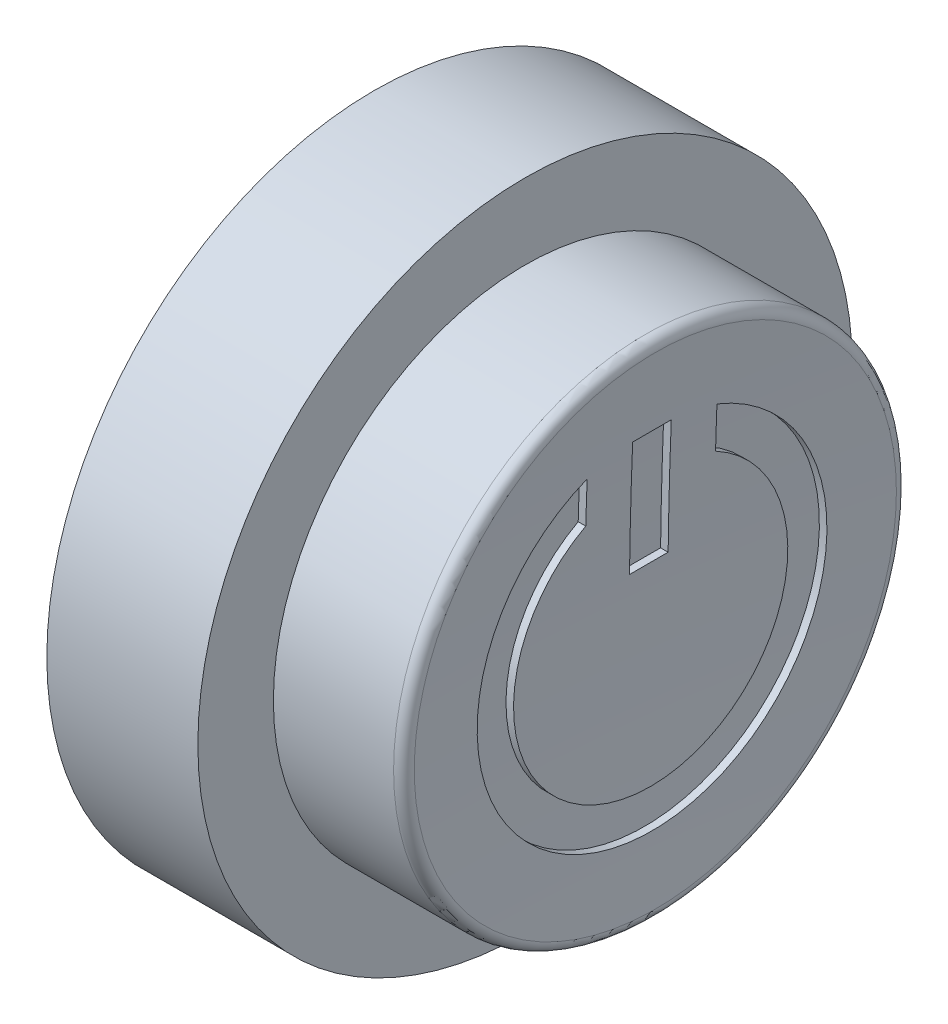
ISO-10303-21;
HEADER;
FILE_DESCRIPTION(('STEP AP214'),'2;1');
FILE_NAME('part.step','',(''),(''),'','','');
FILE_SCHEMA(('AUTOMOTIVE_DESIGN { 1 0 10303 214 1 1 1 1 }'));
ENDSEC;
DATA;
#1=APPLICATION_CONTEXT('core data for automotive mechanical design processes');
#2=APPLICATION_PROTOCOL_DEFINITION('international standard','automotive_design',2000,#1);
#3=PRODUCT_CONTEXT('',#1,'mechanical');
#4=PRODUCT('Part','Part','',(#3));
#5=PRODUCT_RELATED_PRODUCT_CATEGORY('part','',(#4));
#6=PRODUCT_DEFINITION_FORMATION('','',#4);
#7=PRODUCT_DEFINITION_CONTEXT('part definition',#1,'design');
#8=PRODUCT_DEFINITION('design','',#6,#7);
#9=PRODUCT_DEFINITION_SHAPE('','',#8);
#10=(LENGTH_UNIT() NAMED_UNIT(*) SI_UNIT(.MILLI.,.METRE.));
#11=(NAMED_UNIT(*) PLANE_ANGLE_UNIT() SI_UNIT($,.RADIAN.));
#12=(NAMED_UNIT(*) SI_UNIT($,.STERADIAN.) SOLID_ANGLE_UNIT());
#13=UNCERTAINTY_MEASURE_WITH_UNIT(LENGTH_MEASURE(1.E-05),#10,'distance_accuracy_value','');
#14=(GEOMETRIC_REPRESENTATION_CONTEXT(3) GLOBAL_UNCERTAINTY_ASSIGNED_CONTEXT((#13)) GLOBAL_UNIT_ASSIGNED_CONTEXT((#10,
#11,#12)) REPRESENTATION_CONTEXT('',''));
#15=CARTESIAN_POINT('',(0.,0.,0.));
#16=DIRECTION('',(0.,0.,1.));
#17=DIRECTION('',(1.,0.,0.));
#18=AXIS2_PLACEMENT_3D('',#15,#16,#17);
#19=CARTESIAN_POINT('',(154.758333333335,0.,0.));
#20=DIRECTION('',(0.,0.,1.));
#21=DIRECTION('',(1.,0.,0.));
#22=AXIS2_PLACEMENT_3D('',#19,#20,#21);
#23=SPHERICAL_SURFACE('',#22,83.4083333333348);
#24=CARTESIAN_POINT('',(71.4875691609517,0.,0.));
#25=DIRECTION('',(1.,0.,0.));
#26=DIRECTION('',(0.,0.,-1.));
#27=AXIS2_PLACEMENT_3D('',#24,#25,#26);
#28=CIRCLE('',#27,4.78851789095983);
#29=CARTESIAN_POINT('',(71.4875691609517,0.,-4.78851789095983));
#30=VERTEX_POINT('',#29);
#31=EDGE_CURVE('E11',#30,#30,#28,.T.);
#32=ORIENTED_EDGE('',*,*,#31,.T.);
#33=EDGE_LOOP('',(#32));
#34=FACE_BOUND('',#33,.T.);
#35=CARTESIAN_POINT('',(154.758333333335,0.,-0.383692180332946));
#36=DIRECTION('',(0.,0.,1.));
#37=DIRECTION('',(1.,0.,0.));
#38=AXIS2_PLACEMENT_3D('',#35,#36,#37);
#39=CIRCLE('',#38,83.4074508048019);
#40=CARTESIAN_POINT('',(71.4203978778737,3.40460919590601,-0.383692180332937));
#41=VERTEX_POINT('',#40);
#42=CARTESIAN_POINT('',(71.3580757273673,1.09539080409399,-0.383692180332956));
#43=VERTEX_POINT('',#42);
#44=EDGE_CURVE('E148',#41,#43,#39,.T.);
#45=ORIENTED_EDGE('',*,*,#44,.T.);
#46=CARTESIAN_POINT('',(154.758333333335,1.09539080409399,0.));
#47=DIRECTION('',(0.,1.,0.));
#48=DIRECTION('',(0.,0.,1.));
#49=AXIS2_PLACEMENT_3D('',#46,#47,#48);
#50=CIRCLE('',#49,83.401140210617);
#51=CARTESIAN_POINT('',(71.3580757273672,1.09539080409399,0.38369218033294));
#52=VERTEX_POINT('',#51);
#53=EDGE_CURVE('E153',#43,#52,#50,.T.);
#54=ORIENTED_EDGE('',*,*,#53,.T.);
#55=CARTESIAN_POINT('',(154.758333333335,0.,0.383692180332946));
#56=DIRECTION('',(0.,0.,-1.));
#57=DIRECTION('',(-1.,0.,0.));
#58=AXIS2_PLACEMENT_3D('',#55,#56,#57);
#59=CIRCLE('',#58,83.4074508048019);
#60=CARTESIAN_POINT('',(71.4203978778737,3.40460919590601,0.383692180332946));
#61=VERTEX_POINT('',#60);
#62=EDGE_CURVE('E140',#52,#61,#59,.T.);
#63=ORIENTED_EDGE('',*,*,#62,.T.);
#64=CARTESIAN_POINT('',(154.758333333335,3.40460919590601,0.));
#65=DIRECTION('',(0.,-1.,0.));
#66=DIRECTION('',(0.,0.,-1.));
#67=AXIS2_PLACEMENT_3D('',#64,#65,#66);
#68=CIRCLE('',#67,83.3388187201369);
#69=EDGE_CURVE('E145',#61,#41,#68,.T.);
#70=ORIENTED_EDGE('',*,*,#69,.T.);
#71=EDGE_LOOP('',(#45,#54,#63,#70));
#72=FACE_BOUND('',#71,.T.);
#73=CARTESIAN_POINT('',(71.4223832634752,0.,0.));
#74=DIRECTION('',(1.,0.,0.));
#75=DIRECTION('',(0.,0.,-1.));
#76=AXIS2_PLACEMENT_3D('',#73,#74,#75);
#77=CIRCLE('',#76,3.47411793100769);
#78=CARTESIAN_POINT('',(71.4223832634752,3.22610403637305,1.28908810600622));
#79=VERTEX_POINT('',#78);
#80=CARTESIAN_POINT('',(71.4223832634752,3.22610403637305,-1.28908810600623));
#81=VERTEX_POINT('',#80);
#82=EDGE_CURVE('E51',#79,#81,#77,.T.);
#83=ORIENTED_EDGE('',*,*,#82,.F.);
#84=CARTESIAN_POINT('',(154.758333333335,0.,1.28908810600623));
#85=DIRECTION('',(0.,0.,1.));
#86=DIRECTION('',(1.,0.,0.));
#87=AXIS2_PLACEMENT_3D('',#84,#85,#86);
#88=CIRCLE('',#87,83.3983712149083);
#89=CARTESIAN_POINT('',(71.3944967437041,2.39980631655784,1.28908810600623));
#90=VERTEX_POINT('',#89);
#91=EDGE_CURVE('E110',#79,#90,#88,.T.);
#92=ORIENTED_EDGE('',*,*,#91,.T.);
#93=CARTESIAN_POINT('',(71.3944967437041,0.,0.));
#94=DIRECTION('',(1.,0.,0.));
#95=DIRECTION('',(0.,0.,-1.));
#96=AXIS2_PLACEMENT_3D('',#93,#94,#95);
#97=CIRCLE('',#96,2.72411793100769);
#98=CARTESIAN_POINT('',(71.3944967437041,2.39980631655784,-1.28908810600623));
#99=VERTEX_POINT('',#98);
#100=EDGE_CURVE('E129',#90,#99,#97,.T.);
#101=ORIENTED_EDGE('',*,*,#100,.T.);
#102=CARTESIAN_POINT('',(154.758333333335,0.,-1.28908810600623));
#103=DIRECTION('',(0.,0.,-1.));
#104=DIRECTION('',(-1.,0.,0.));
#105=AXIS2_PLACEMENT_3D('',#102,#103,#104);
#106=CIRCLE('',#105,83.3983712149083);
#107=EDGE_CURVE('E120',#99,#81,#106,.T.);
#108=ORIENTED_EDGE('',*,*,#107,.T.);
#109=EDGE_LOOP('',(#83,#92,#101,#108));
#110=FACE_BOUND('',#109,.T.);
#111=ADVANCED_FACE('F36',(#34,#72,#110),#23,.F.);
#112=CARTESIAN_POINT('',(70.5,0.,0.));
#113=DIRECTION('',(-1.,0.,0.));
#114=DIRECTION('',(0.,0.,1.));
#115=AXIS2_PLACEMENT_3D('',#112,#113,#114);
#116=CYLINDRICAL_SURFACE('',#115,5.);
#117=CARTESIAN_POINT('',(71.2878990300558,0.,0.));
#118=DIRECTION('',(1.,0.,0.));
#119=DIRECTION('',(0.,0.,-1.));
#120=AXIS2_PLACEMENT_3D('',#117,#118,#119);
#121=CIRCLE('',#120,5.);
#122=CARTESIAN_POINT('',(71.2878990300558,0.,-5.));
#123=VERTEX_POINT('',#122);
#124=EDGE_CURVE('E44',#123,#123,#121,.F.);
#125=ORIENTED_EDGE('',*,*,#124,.T.);
#126=EDGE_LOOP('',(#125));
#127=FACE_BOUND('',#126,.T.);
#128=CARTESIAN_POINT('',(68.9,0.,0.));
#129=DIRECTION('',(-1.,0.,0.));
#130=DIRECTION('',(0.,0.,1.));
#131=AXIS2_PLACEMENT_3D('',#128,#129,#130);
#132=CIRCLE('',#131,5.);
#133=CARTESIAN_POINT('',(68.9,0.,5.));
#134=VERTEX_POINT('',#133);
#135=EDGE_CURVE('E143',#134,#134,#132,.T.);
#136=ORIENTED_EDGE('',*,*,#135,.F.);
#137=EDGE_LOOP('',(#136));
#138=FACE_BOUND('',#137,.T.);
#139=ADVANCED_FACE('F192',(#127,#138),#116,.T.);
#140=CARTESIAN_POINT('',(70.5,1.75,0.));
#141=DIRECTION('',(1.,0.,0.));
#142=DIRECTION('',(0.,0.,-1.));
#143=AXIS2_PLACEMENT_3D('',#140,#141,#142);
#144=PLANE('',#143);
#145=CARTESIAN_POINT('',(70.5,0.,0.));
#146=DIRECTION('',(-1.,0.,0.));
#147=DIRECTION('',(0.,0.,1.));
#148=AXIS2_PLACEMENT_3D('',#145,#146,#147);
#149=CIRCLE('',#148,1.75);
#150=CARTESIAN_POINT('',(70.5,0.,1.75));
#151=VERTEX_POINT('',#150);
#152=EDGE_CURVE('E187',#151,#151,#149,.T.);
#153=ORIENTED_EDGE('',*,*,#152,.T.);
#154=EDGE_LOOP('',(#153));
#155=FACE_BOUND('',#154,.T.);
#156=ADVANCED_FACE('F221',(#155),#144,.F.);
#157=CARTESIAN_POINT('',(70.5,0.,0.));
#158=DIRECTION('',(-1.,0.,0.));
#159=DIRECTION('',(0.,0.,1.));
#160=AXIS2_PLACEMENT_3D('',#157,#158,#159);
#161=CYLINDRICAL_SURFACE('',#160,1.75);
#162=ORIENTED_EDGE('',*,*,#152,.F.);
#163=EDGE_LOOP('',(#162));
#164=FACE_BOUND('',#163,.T.);
#165=CARTESIAN_POINT('',(67.5,0.,0.));
#166=DIRECTION('',(-1.,0.,0.));
#167=DIRECTION('',(0.,0.,1.));
#168=AXIS2_PLACEMENT_3D('',#165,#166,#167);
#169=CIRCLE('',#168,1.75);
#170=CARTESIAN_POINT('',(67.5,0.,1.75));
#171=VERTEX_POINT('',#170);
#172=EDGE_CURVE('E184',#171,#171,#169,.T.);
#173=ORIENTED_EDGE('',*,*,#172,.T.);
#174=EDGE_LOOP('',(#173));
#175=FACE_BOUND('',#174,.T.);
#176=ADVANCED_FACE('F227',(#164,#175),#161,.F.);
#177=CARTESIAN_POINT('',(67.5,5.25,0.));
#178=DIRECTION('',(1.,0.,0.));
#179=DIRECTION('',(0.,0.,-1.));
#180=AXIS2_PLACEMENT_3D('',#177,#178,#179);
#181=PLANE('',#180);
#182=ORIENTED_EDGE('',*,*,#172,.F.);
#183=EDGE_LOOP('',(#182));
#184=FACE_BOUND('',#183,.T.);
#185=CARTESIAN_POINT('',(67.5,0.,0.));
#186=DIRECTION('',(-1.,0.,0.));
#187=DIRECTION('',(0.,0.,1.));
#188=AXIS2_PLACEMENT_3D('',#185,#186,#187);
#189=CIRCLE('',#188,5.25);
#190=CARTESIAN_POINT('',(67.5,0.,5.25));
#191=VERTEX_POINT('',#190);
#192=EDGE_CURVE('E181',#191,#191,#189,.T.);
#193=ORIENTED_EDGE('',*,*,#192,.T.);
#194=EDGE_LOOP('',(#193));
#195=FACE_BOUND('',#194,.T.);
#196=ADVANCED_FACE('F231',(#184,#195),#181,.F.);
#197=CARTESIAN_POINT('',(70.5,0.,0.));
#198=DIRECTION('',(-1.,0.,0.));
#199=DIRECTION('',(0.,0.,1.));
#200=AXIS2_PLACEMENT_3D('',#197,#198,#199);
#201=CYLINDRICAL_SURFACE('',#200,5.25);
#202=ORIENTED_EDGE('',*,*,#192,.F.);
#203=EDGE_LOOP('',(#202));
#204=FACE_BOUND('',#203,.T.);
#205=CARTESIAN_POINT('',(65.9,0.,0.));
#206=DIRECTION('',(-1.,0.,0.));
#207=DIRECTION('',(0.,0.,1.));
#208=AXIS2_PLACEMENT_3D('',#205,#206,#207);
#209=CIRCLE('',#208,5.25);
#210=CARTESIAN_POINT('',(65.9,0.,5.25));
#211=VERTEX_POINT('',#210);
#212=EDGE_CURVE('E178',#211,#211,#209,.T.);
#213=ORIENTED_EDGE('',*,*,#212,.T.);
#214=EDGE_LOOP('',(#213));
#215=FACE_BOUND('',#214,.T.);
#216=ADVANCED_FACE('F235',(#204,#215),#201,.F.);
#217=CARTESIAN_POINT('',(65.9,5.25,0.));
#218=DIRECTION('',(1.,0.,0.));
#219=DIRECTION('',(0.,0.,-1.));
#220=AXIS2_PLACEMENT_3D('',#217,#218,#219);
#221=PLANE('',#220);
#222=ORIENTED_EDGE('',*,*,#212,.F.);
#223=EDGE_LOOP('',(#222));
#224=FACE_BOUND('',#223,.T.);
#225=CARTESIAN_POINT('',(65.9,0.,0.));
#226=DIRECTION('',(-1.,0.,0.));
#227=DIRECTION('',(0.,0.,1.));
#228=AXIS2_PLACEMENT_3D('',#225,#226,#227);
#229=CIRCLE('',#228,6.5);
#230=CARTESIAN_POINT('',(65.9,0.,6.5));
#231=VERTEX_POINT('',#230);
#232=EDGE_CURVE('E175',#231,#231,#229,.T.);
#233=ORIENTED_EDGE('',*,*,#232,.T.);
#234=EDGE_LOOP('',(#233));
#235=FACE_BOUND('',#234,.T.);
#236=ADVANCED_FACE('F239',(#224,#235),#221,.F.);
#237=CARTESIAN_POINT('',(70.5,0.,0.));
#238=DIRECTION('',(-1.,0.,0.));
#239=DIRECTION('',(0.,0.,1.));
#240=AXIS2_PLACEMENT_3D('',#237,#238,#239);
#241=CYLINDRICAL_SURFACE('',#240,6.5);
#242=ORIENTED_EDGE('',*,*,#232,.F.);
#243=EDGE_LOOP('',(#242));
#244=FACE_BOUND('',#243,.T.);
#245=CARTESIAN_POINT('',(68.9,0.,0.));
#246=DIRECTION('',(-1.,0.,0.));
#247=DIRECTION('',(0.,0.,1.));
#248=AXIS2_PLACEMENT_3D('',#245,#246,#247);
#249=CIRCLE('',#248,6.5);
#250=CARTESIAN_POINT('',(68.9,0.,6.5));
#251=VERTEX_POINT('',#250);
#252=EDGE_CURVE('E172',#251,#251,#249,.T.);
#253=ORIENTED_EDGE('',*,*,#252,.T.);
#254=EDGE_LOOP('',(#253));
#255=FACE_BOUND('',#254,.T.);
#256=ADVANCED_FACE('F208',(#244,#255),#241,.T.);
#257=CARTESIAN_POINT('',(68.9,6.5,0.));
#258=DIRECTION('',(-1.,0.,0.));
#259=DIRECTION('',(0.,0.,1.));
#260=AXIS2_PLACEMENT_3D('',#257,#258,#259);
#261=PLANE('',#260);
#262=ORIENTED_EDGE('',*,*,#252,.F.);
#263=EDGE_LOOP('',(#262));
#264=FACE_BOUND('',#263,.T.);
#265=ORIENTED_EDGE('',*,*,#135,.T.);
#266=EDGE_LOOP('',(#265));
#267=FACE_BOUND('',#266,.T.);
#268=ADVANCED_FACE('F197',(#264,#267),#261,.F.);
#269=CARTESIAN_POINT('',(71.2878990300558,0.,0.));
#270=DIRECTION('',(1.,0.,0.));
#271=DIRECTION('',(0.,0.,-1.));
#272=AXIS2_PLACEMENT_3D('',#269,#270,#271);
#273=TOROIDAL_SURFACE('',#272,4.8,0.2);
#274=ORIENTED_EDGE('',*,*,#31,.F.);
#275=EDGE_LOOP('',(#274));
#276=FACE_BOUND('',#275,.T.);
#277=ORIENTED_EDGE('',*,*,#124,.F.);
#278=EDGE_LOOP('',(#277));
#279=FACE_BOUND('',#278,.T.);
#280=ADVANCED_FACE('F38',(#276,#279),#273,.T.);
#281=CARTESIAN_POINT('',(154.608333333335,0.,0.));
#282=DIRECTION('',(0.,0.,1.));
#283=DIRECTION('',(1.,0.,0.));
#284=AXIS2_PLACEMENT_3D('',#281,#282,#283);
#285=SPHERICAL_SURFACE('',#284,83.4083333333348);
#286=CARTESIAN_POINT('',(154.608333333335,0.,0.383692180332946));
#287=DIRECTION('',(0.,0.,-1.));
#288=DIRECTION('',(-1.,0.,0.));
#289=AXIS2_PLACEMENT_3D('',#286,#287,#288);
#290=CIRCLE('',#289,83.4074508048019);
#291=CARTESIAN_POINT('',(71.2080757273673,1.09539080409399,0.38369218033294));
#292=VERTEX_POINT('',#291);
#293=CARTESIAN_POINT('',(71.2703978778737,3.40460919590601,0.383692180332952));
#294=VERTEX_POINT('',#293);
#295=EDGE_CURVE('E144',#292,#294,#290,.T.);
#296=ORIENTED_EDGE('',*,*,#295,.F.);
#297=CARTESIAN_POINT('',(154.608333333335,1.09539080409399,0.));
#298=DIRECTION('',(0.,1.,0.));
#299=DIRECTION('',(0.,0.,1.));
#300=AXIS2_PLACEMENT_3D('',#297,#298,#299);
#301=CIRCLE('',#300,83.401140210617);
#302=CARTESIAN_POINT('',(71.2080757273673,1.09539080409399,-0.383692180332956));
#303=VERTEX_POINT('',#302);
#304=EDGE_CURVE('E116',#303,#292,#301,.T.);
#305=ORIENTED_EDGE('',*,*,#304,.F.);
#306=CARTESIAN_POINT('',(154.608333333335,0.,-0.383692180332946));
#307=DIRECTION('',(0.,0.,1.));
#308=DIRECTION('',(1.,0.,0.));
#309=AXIS2_PLACEMENT_3D('',#306,#307,#308);
#310=CIRCLE('',#309,83.4074508048019);
#311=CARTESIAN_POINT('',(71.2703978778738,3.40460919590601,-0.383692180332937));
#312=VERTEX_POINT('',#311);
#313=EDGE_CURVE('E160',#312,#303,#310,.T.);
#314=ORIENTED_EDGE('',*,*,#313,.F.);
#315=CARTESIAN_POINT('',(154.608333333335,3.40460919590601,0.));
#316=DIRECTION('',(0.,-1.,0.));
#317=DIRECTION('',(0.,0.,-1.));
#318=AXIS2_PLACEMENT_3D('',#315,#316,#317);
#319=CIRCLE('',#318,83.3388187201369);
#320=EDGE_CURVE('E151',#294,#312,#319,.T.);
#321=ORIENTED_EDGE('',*,*,#320,.F.);
#322=EDGE_LOOP('',(#296,#305,#314,#321));
#323=FACE_BOUND('',#322,.T.);
#324=ADVANCED_FACE('F196',(#323),#285,.F.);
#325=CARTESIAN_POINT('',(71.3580757273672,1.09539080409399,0.383692180332946));
#326=DIRECTION('',(0.,-1.,0.));
#327=DIRECTION('',(0.,0.,-1.));
#328=AXIS2_PLACEMENT_3D('',#325,#326,#327);
#329=PLANE('',#328);
#330=ORIENTED_EDGE('',*,*,#304,.T.);
#331=DIRECTION('',(-1.,0.,0.));
#332=VECTOR('',#331,1.);
#333=CARTESIAN_POINT('',(71.3580757273672,1.09539080409399,0.383692180332946));
#334=LINE('',#333,#332);
#335=EDGE_CURVE('E156',#52,#292,#334,.T.);
#336=ORIENTED_EDGE('',*,*,#335,.F.);
#337=ORIENTED_EDGE('',*,*,#53,.F.);
#338=DIRECTION('',(-1.,0.,0.));
#339=VECTOR('',#338,1.);
#340=CARTESIAN_POINT('',(71.3580757273673,1.09539080409399,-0.383692180332946));
#341=LINE('',#340,#339);
#342=EDGE_CURVE('E157',#43,#303,#341,.T.);
#343=ORIENTED_EDGE('',*,*,#342,.T.);
#344=EDGE_LOOP('',(#330,#336,#337,#343));
#345=FACE_BOUND('',#344,.T.);
#346=ADVANCED_FACE('F204',(#345),#329,.F.);
#347=CARTESIAN_POINT('',(71.3580757273673,1.09539080409399,-0.383692180332946));
#348=DIRECTION('',(0.,0.,-1.));
#349=DIRECTION('',(0.,1.,0.));
#350=AXIS2_PLACEMENT_3D('',#347,#348,#349);
#351=PLANE('',#350);
#352=ORIENTED_EDGE('',*,*,#313,.T.);
#353=ORIENTED_EDGE('',*,*,#342,.F.);
#354=ORIENTED_EDGE('',*,*,#44,.F.);
#355=DIRECTION('',(-1.,0.,0.));
#356=VECTOR('',#355,1.);
#357=CARTESIAN_POINT('',(71.4203978778738,3.40460919590601,-0.383692180332928));
#358=LINE('',#357,#356);
#359=EDGE_CURVE('E152',#41,#312,#358,.T.);
#360=ORIENTED_EDGE('',*,*,#359,.T.);
#361=EDGE_LOOP('',(#352,#353,#354,#360));
#362=FACE_BOUND('',#361,.T.);
#363=ADVANCED_FACE('F249',(#362),#351,.F.);
#364=CARTESIAN_POINT('',(71.4203978778738,3.40460919590601,-0.383692180332928));
#365=DIRECTION('',(0.,1.,0.));
#366=DIRECTION('',(0.,0.,1.));
#367=AXIS2_PLACEMENT_3D('',#364,#365,#366);
#368=PLANE('',#367);
#369=ORIENTED_EDGE('',*,*,#320,.T.);
#370=ORIENTED_EDGE('',*,*,#359,.F.);
#371=ORIENTED_EDGE('',*,*,#69,.F.);
#372=DIRECTION('',(-1.,0.,0.));
#373=VECTOR('',#372,1.);
#374=CARTESIAN_POINT('',(71.4203978778737,3.40460919590601,0.383692180332946));
#375=LINE('',#374,#373);
#376=EDGE_CURVE('E59',#61,#294,#375,.T.);
#377=ORIENTED_EDGE('',*,*,#376,.T.);
#378=EDGE_LOOP('',(#369,#370,#371,#377));
#379=FACE_BOUND('',#378,.T.);
#380=ADVANCED_FACE('F214',(#379),#368,.F.);
#381=CARTESIAN_POINT('',(71.4203978778737,3.40460919590601,0.383692180332946));
#382=DIRECTION('',(0.,0.,1.));
#383=DIRECTION('',(1.,0.,0.));
#384=AXIS2_PLACEMENT_3D('',#381,#382,#383);
#385=PLANE('',#384);
#386=ORIENTED_EDGE('',*,*,#295,.T.);
#387=ORIENTED_EDGE('',*,*,#376,.F.);
#388=ORIENTED_EDGE('',*,*,#62,.F.);
#389=ORIENTED_EDGE('',*,*,#335,.T.);
#390=EDGE_LOOP('',(#386,#387,#388,#389));
#391=FACE_BOUND('',#390,.T.);
#392=ADVANCED_FACE('F199',(#391),#385,.F.);
#393=CARTESIAN_POINT('',(154.608333333335,0.,0.));
#394=DIRECTION('',(0.,0.,1.));
#395=DIRECTION('',(1.,0.,0.));
#396=AXIS2_PLACEMENT_3D('',#393,#394,#395);
#397=SPHERICAL_SURFACE('',#396,83.4083333333348);
#398=CARTESIAN_POINT('',(154.608333333335,0.,1.28908810600623));
#399=DIRECTION('',(0.,0.,1.));
#400=DIRECTION('',(1.,0.,0.));
#401=AXIS2_PLACEMENT_3D('',#398,#399,#400);
#402=CIRCLE('',#401,83.3983712149083);
#403=CARTESIAN_POINT('',(71.2723832634751,3.22610403637305,1.28908810600622));
#404=VERTEX_POINT('',#403);
#405=CARTESIAN_POINT('',(71.2444967437041,2.39980631655784,1.28908810600623));
#406=VERTEX_POINT('',#405);
#407=EDGE_CURVE('E117',#404,#406,#402,.T.);
#408=ORIENTED_EDGE('',*,*,#407,.F.);
#409=CARTESIAN_POINT('',(71.2723832634751,0.,0.));
#410=DIRECTION('',(1.,0.,0.));
#411=DIRECTION('',(0.,0.,-1.));
#412=AXIS2_PLACEMENT_3D('',#409,#410,#411);
#413=CIRCLE('',#412,3.47411793100769);
#414=CARTESIAN_POINT('',(71.2723832634751,3.22610403637304,-1.28908810600623));
#415=VERTEX_POINT('',#414);
#416=EDGE_CURVE('E104',#404,#415,#413,.T.);
#417=ORIENTED_EDGE('',*,*,#416,.T.);
#418=CARTESIAN_POINT('',(154.608333333335,0.,-1.28908810600623));
#419=DIRECTION('',(0.,0.,-1.));
#420=DIRECTION('',(-1.,0.,0.));
#421=AXIS2_PLACEMENT_3D('',#418,#419,#420);
#422=CIRCLE('',#421,83.3983712149083);
#423=CARTESIAN_POINT('',(71.2444967437041,2.39980631655784,-1.28908810600623));
#424=VERTEX_POINT('',#423);
#425=EDGE_CURVE('E123',#424,#415,#422,.T.);
#426=ORIENTED_EDGE('',*,*,#425,.F.);
#427=CARTESIAN_POINT('',(71.2444967437041,0.,0.));
#428=DIRECTION('',(1.,0.,0.));
#429=DIRECTION('',(0.,0.,-1.));
#430=AXIS2_PLACEMENT_3D('',#427,#428,#429);
#431=CIRCLE('',#430,2.72411793100769);
#432=EDGE_CURVE('E130',#406,#424,#431,.T.);
#433=ORIENTED_EDGE('',*,*,#432,.F.);
#434=EDGE_LOOP('',(#408,#417,#426,#433));
#435=FACE_BOUND('',#434,.T.);
#436=ADVANCED_FACE('F213',(#435),#397,.F.);
#437=CARTESIAN_POINT('',(71.4223832634752,0.,0.));
#438=DIRECTION('',(-1.,0.,0.));
#439=DIRECTION('',(0.,0.,1.));
#440=AXIS2_PLACEMENT_3D('',#437,#438,#439);
#441=CYLINDRICAL_SURFACE('',#440,3.47411793100769);
#442=ORIENTED_EDGE('',*,*,#416,.F.);
#443=DIRECTION('',(-1.,0.,0.));
#444=VECTOR('',#443,1.);
#445=CARTESIAN_POINT('',(71.4223832634752,3.22610403637305,1.28908810600623));
#446=LINE('',#445,#444);
#447=EDGE_CURVE('E101',#79,#404,#446,.T.);
#448=ORIENTED_EDGE('',*,*,#447,.F.);
#449=ORIENTED_EDGE('',*,*,#82,.T.);
#450=DIRECTION('',(-1.,0.,0.));
#451=VECTOR('',#450,1.);
#452=CARTESIAN_POINT('',(71.4223832634752,3.22610403637304,-1.28908810600623));
#453=LINE('',#452,#451);
#454=EDGE_CURVE('E121',#81,#415,#453,.T.);
#455=ORIENTED_EDGE('',*,*,#454,.T.);
#456=EDGE_LOOP('',(#442,#448,#449,#455));
#457=FACE_BOUND('',#456,.T.);
#458=ADVANCED_FACE('F103',(#457),#441,.F.);
#459=CARTESIAN_POINT('',(71.3944967437041,2.39980631655784,1.28908810600623));
#460=DIRECTION('',(0.,0.,-1.));
#461=DIRECTION('',(-1.,0.,0.));
#462=AXIS2_PLACEMENT_3D('',#459,#460,#461);
#463=PLANE('',#462);
#464=ORIENTED_EDGE('',*,*,#407,.T.);
#465=DIRECTION('',(-1.,0.,0.));
#466=VECTOR('',#465,1.);
#467=CARTESIAN_POINT('',(71.3944967437041,2.39980631655784,1.28908810600623));
#468=LINE('',#467,#466);
#469=EDGE_CURVE('E113',#90,#406,#468,.T.);
#470=ORIENTED_EDGE('',*,*,#469,.F.);
#471=ORIENTED_EDGE('',*,*,#91,.F.);
#472=ORIENTED_EDGE('',*,*,#447,.T.);
#473=EDGE_LOOP('',(#464,#470,#471,#472));
#474=FACE_BOUND('',#473,.T.);
#475=ADVANCED_FACE('F111',(#474),#463,.F.);
#476=CARTESIAN_POINT('',(71.3944967437041,0.,0.));
#477=DIRECTION('',(-1.,0.,0.));
#478=DIRECTION('',(0.,0.,1.));
#479=AXIS2_PLACEMENT_3D('',#476,#477,#478);
#480=CYLINDRICAL_SURFACE('',#479,2.72411793100769);
#481=ORIENTED_EDGE('',*,*,#432,.T.);
#482=DIRECTION('',(-1.,0.,0.));
#483=VECTOR('',#482,1.);
#484=CARTESIAN_POINT('',(71.3944967437041,2.39980631655784,-1.28908810600623));
#485=LINE('',#484,#483);
#486=EDGE_CURVE('E135',#99,#424,#485,.T.);
#487=ORIENTED_EDGE('',*,*,#486,.F.);
#488=ORIENTED_EDGE('',*,*,#100,.F.);
#489=ORIENTED_EDGE('',*,*,#469,.T.);
#490=EDGE_LOOP('',(#481,#487,#488,#489));
#491=FACE_BOUND('',#490,.T.);
#492=ADVANCED_FACE('F262',(#491),#480,.T.);
#493=CARTESIAN_POINT('',(71.4223832634752,3.22610403637304,-1.28908810600623));
#494=DIRECTION('',(0.,0.,1.));
#495=DIRECTION('',(0.,-1.,0.));
#496=AXIS2_PLACEMENT_3D('',#493,#494,#495);
#497=PLANE('',#496);
#498=ORIENTED_EDGE('',*,*,#425,.T.);
#499=ORIENTED_EDGE('',*,*,#454,.F.);
#500=ORIENTED_EDGE('',*,*,#107,.F.);
#501=ORIENTED_EDGE('',*,*,#486,.T.);
#502=EDGE_LOOP('',(#498,#499,#500,#501));
#503=FACE_BOUND('',#502,.T.);
#504=ADVANCED_FACE('F207',(#503),#497,.F.);
#505=CLOSED_SHELL('',(#111,#139,#156,#176,#196,#216,#236,#256,#268,#280,#324,#346,#363,#380,
#392,#436,#458,#475,#492,#504));
#506=MANIFOLD_SOLID_BREP('B2',#505);
#507=ADVANCED_BREP_SHAPE_REPRESENTATION('',(#18,#506),#14);
#508=SHAPE_DEFINITION_REPRESENTATION(#9,#507);
ENDSEC;
END-ISO-10303-21;
